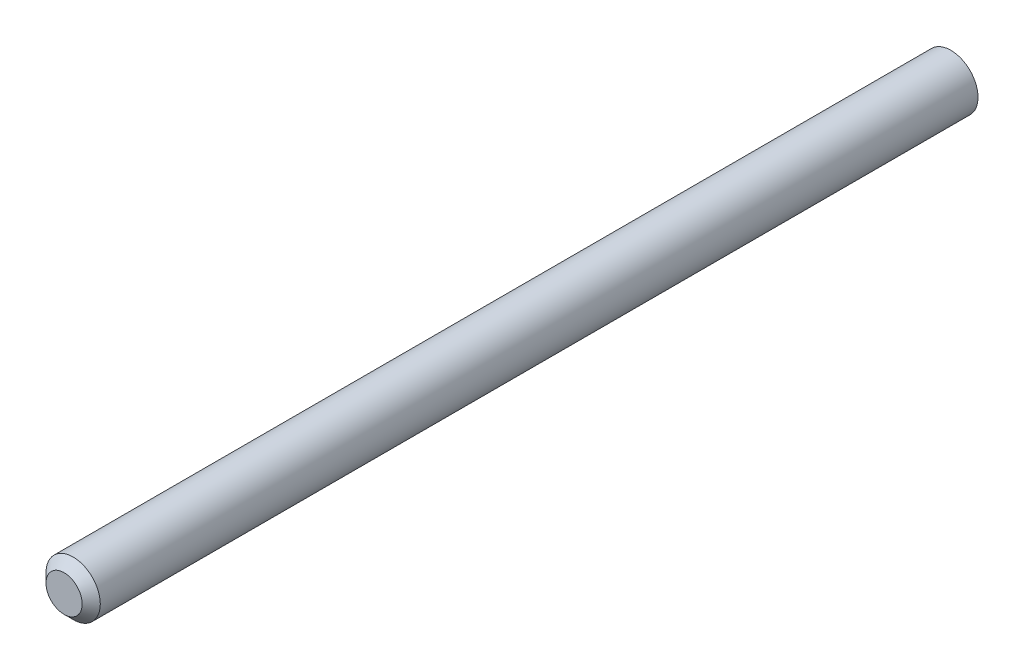
ISO-10303-21;
HEADER;
FILE_DESCRIPTION(('STEP AP214'),'2;1');
FILE_NAME('part.step','',(''),(''),'','','');
FILE_SCHEMA(('AUTOMOTIVE_DESIGN { 1 0 10303 214 1 1 1 1 }'));
ENDSEC;
DATA;
#1=APPLICATION_CONTEXT('core data for automotive mechanical design processes');
#2=APPLICATION_PROTOCOL_DEFINITION('international standard','automotive_design',2000,#1);
#3=PRODUCT_CONTEXT('',#1,'mechanical');
#4=PRODUCT('Part','Part','',(#3));
#5=PRODUCT_RELATED_PRODUCT_CATEGORY('part','',(#4));
#6=PRODUCT_DEFINITION_FORMATION('','',#4);
#7=PRODUCT_DEFINITION_CONTEXT('part definition',#1,'design');
#8=PRODUCT_DEFINITION('design','',#6,#7);
#9=PRODUCT_DEFINITION_SHAPE('','',#8);
#10=(LENGTH_UNIT() NAMED_UNIT(*) SI_UNIT(.MILLI.,.METRE.));
#11=(NAMED_UNIT(*) PLANE_ANGLE_UNIT() SI_UNIT($,.RADIAN.));
#12=(NAMED_UNIT(*) SI_UNIT($,.STERADIAN.) SOLID_ANGLE_UNIT());
#13=UNCERTAINTY_MEASURE_WITH_UNIT(LENGTH_MEASURE(1.E-05),#10,'distance_accuracy_value','');
#14=(GEOMETRIC_REPRESENTATION_CONTEXT(3) GLOBAL_UNCERTAINTY_ASSIGNED_CONTEXT((#13)) GLOBAL_UNIT_ASSIGNED_CONTEXT((#10,
#11,#12)) REPRESENTATION_CONTEXT('',''));
#15=CARTESIAN_POINT('',(0.,0.,0.));
#16=DIRECTION('',(0.,0.,1.));
#17=DIRECTION('',(1.,0.,0.));
#18=AXIS2_PLACEMENT_3D('',#15,#16,#17);
#19=CARTESIAN_POINT('',(0.,0.,98.));
#20=DIRECTION('',(0.,0.,-1.));
#21=DIRECTION('',(-1.,0.,0.));
#22=AXIS2_PLACEMENT_3D('',#19,#20,#21);
#23=CYLINDRICAL_SURFACE('',#22,3.);
#24=CARTESIAN_POINT('',(0.,0.,97.));
#25=DIRECTION('',(0.,0.,1.));
#26=DIRECTION('',(1.,0.,0.));
#27=AXIS2_PLACEMENT_3D('',#24,#25,#26);
#28=CIRCLE('',#27,3.);
#29=CARTESIAN_POINT('',(3.,0.,97.));
#30=VERTEX_POINT('',#29);
#31=EDGE_CURVE('E10',#30,#30,#28,.F.);
#32=ORIENTED_EDGE('',*,*,#31,.T.);
#33=EDGE_LOOP('',(#32));
#34=FACE_BOUND('',#33,.T.);
#35=CARTESIAN_POINT('',(0.,0.,0.));
#36=DIRECTION('',(0.,0.,1.));
#37=DIRECTION('',(1.,0.,0.));
#38=AXIS2_PLACEMENT_3D('',#35,#36,#37);
#39=CIRCLE('',#38,3.);
#40=CARTESIAN_POINT('',(3.,0.,0.));
#41=VERTEX_POINT('',#40);
#42=EDGE_CURVE('E42',#41,#41,#39,.T.);
#43=ORIENTED_EDGE('',*,*,#42,.T.);
#44=EDGE_LOOP('',(#43));
#45=FACE_BOUND('',#44,.T.);
#46=ADVANCED_FACE('F31',(#34,#45),#23,.T.);
#47=CARTESIAN_POINT('',(0.,0.,98.));
#48=DIRECTION('',(0.,0.,1.));
#49=DIRECTION('',(1.,0.,0.));
#50=AXIS2_PLACEMENT_3D('',#47,#48,#49);
#51=PLANE('',#50);
#52=CARTESIAN_POINT('',(0.,0.,98.));
#53=DIRECTION('',(0.,0.,1.));
#54=DIRECTION('',(1.,0.,0.));
#55=AXIS2_PLACEMENT_3D('',#52,#53,#54);
#56=CIRCLE('',#55,1.99999999999999);
#57=CARTESIAN_POINT('',(1.99999999999999,0.,98.));
#58=VERTEX_POINT('',#57);
#59=EDGE_CURVE('E38',#58,#58,#56,.T.);
#60=ORIENTED_EDGE('',*,*,#59,.T.);
#61=EDGE_LOOP('',(#60));
#62=FACE_BOUND('',#61,.T.);
#63=ADVANCED_FACE('F52',(#62),#51,.T.);
#64=CARTESIAN_POINT('',(0.,0.,0.));
#65=DIRECTION('',(0.,0.,1.));
#66=DIRECTION('',(1.,0.,0.));
#67=AXIS2_PLACEMENT_3D('',#64,#65,#66);
#68=PLANE('',#67);
#69=ORIENTED_EDGE('',*,*,#42,.F.);
#70=EDGE_LOOP('',(#69));
#71=FACE_BOUND('',#70,.T.);
#72=ADVANCED_FACE('F50',(#71),#68,.F.);
#73=CARTESIAN_POINT('',(0.,0.,98.));
#74=DIRECTION('',(0.,0.,-1.));
#75=DIRECTION('',(-1.,0.,0.));
#76=AXIS2_PLACEMENT_3D('',#73,#74,#75);
#77=CONICAL_SURFACE('',#76,1.99999999999999,0.785398163397447);
#78=ORIENTED_EDGE('',*,*,#31,.F.);
#79=EDGE_LOOP('',(#78));
#80=FACE_BOUND('',#79,.T.);
#81=ORIENTED_EDGE('',*,*,#59,.F.);
#82=EDGE_LOOP('',(#81));
#83=FACE_BOUND('',#82,.T.);
#84=ADVANCED_FACE('F33',(#80,#83),#77,.T.);
#85=CLOSED_SHELL('',(#46,#63,#72,#84));
#86=MANIFOLD_SOLID_BREP('B2',#85);
#87=ADVANCED_BREP_SHAPE_REPRESENTATION('',(#18,#86),#14);
#88=SHAPE_DEFINITION_REPRESENTATION(#9,#87);
ENDSEC;
END-ISO-10303-21;
